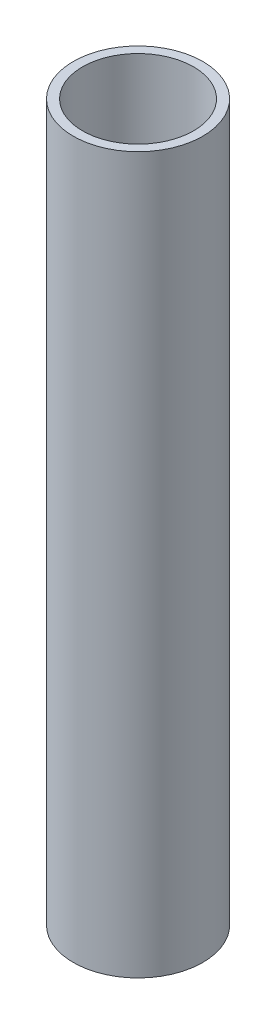
ISO-10303-21;
HEADER;
FILE_DESCRIPTION(('STEP AP214'),'2;1');
FILE_NAME('part.step','',(''),(''),'','','');
FILE_SCHEMA(('AUTOMOTIVE_DESIGN { 1 0 10303 214 1 1 1 1 }'));
ENDSEC;
DATA;
#1=APPLICATION_CONTEXT('core data for automotive mechanical design processes');
#2=APPLICATION_PROTOCOL_DEFINITION('international standard','automotive_design',2000,#1);
#3=PRODUCT_CONTEXT('',#1,'mechanical');
#4=PRODUCT('Part','Part','',(#3));
#5=PRODUCT_RELATED_PRODUCT_CATEGORY('part','',(#4));
#6=PRODUCT_DEFINITION_FORMATION('','',#4);
#7=PRODUCT_DEFINITION_CONTEXT('part definition',#1,'design');
#8=PRODUCT_DEFINITION('design','',#6,#7);
#9=PRODUCT_DEFINITION_SHAPE('','',#8);
#10=(LENGTH_UNIT() NAMED_UNIT(*) SI_UNIT(.MILLI.,.METRE.));
#11=(NAMED_UNIT(*) PLANE_ANGLE_UNIT() SI_UNIT($,.RADIAN.));
#12=(NAMED_UNIT(*) SI_UNIT($,.STERADIAN.) SOLID_ANGLE_UNIT());
#13=UNCERTAINTY_MEASURE_WITH_UNIT(LENGTH_MEASURE(1.E-05),#10,'distance_accuracy_value','');
#14=(GEOMETRIC_REPRESENTATION_CONTEXT(3) GLOBAL_UNCERTAINTY_ASSIGNED_CONTEXT((#13)) GLOBAL_UNIT_ASSIGNED_CONTEXT((#10,
#11,#12)) REPRESENTATION_CONTEXT('',''));
#15=CARTESIAN_POINT('',(0.,0.,0.));
#16=DIRECTION('',(0.,0.,1.));
#17=DIRECTION('',(1.,0.,0.));
#18=AXIS2_PLACEMENT_3D('',#15,#16,#17);
#19=CARTESIAN_POINT('',(0.,232.,0.));
#20=DIRECTION('',(0.,-1.,0.));
#21=DIRECTION('',(0.,0.,-1.));
#22=AXIS2_PLACEMENT_3D('',#19,#20,#21);
#23=CYLINDRICAL_SURFACE('',#22,18.);
#24=CARTESIAN_POINT('',(0.,232.,0.));
#25=DIRECTION('',(0.,1.,0.));
#26=DIRECTION('',(0.,0.,1.));
#27=AXIS2_PLACEMENT_3D('',#24,#25,#26);
#28=CIRCLE('',#27,18.);
#29=CARTESIAN_POINT('',(0.,232.,-18.));
#30=VERTEX_POINT('',#29);
#31=EDGE_CURVE('E47',#30,#30,#28,.T.);
#32=CARTESIAN_POINT('',(0.,0.,0.));
#33=DIRECTION('',(0.,1.,0.));
#34=DIRECTION('',(0.,0.,1.));
#35=AXIS2_PLACEMENT_3D('',#32,#33,#34);
#36=CIRCLE('',#35,18.);
#37=CARTESIAN_POINT('',(0.,0.,-18.));
#38=VERTEX_POINT('',#37);
#39=EDGE_CURVE('E54',#38,#38,#36,.T.);
#40=CARTESIAN_POINT('',(0.,232.,-18.));
#41=CARTESIAN_POINT('',(0.,229.583333333333,-18.));
#42=CARTESIAN_POINT('',(0.,227.166666666667,-18.));
#43=CARTESIAN_POINT('',(0.,222.333333333333,-18.));
#44=CARTESIAN_POINT('',(0.,219.916666666667,-18.));
#45=CARTESIAN_POINT('',(0.,215.083333333333,-18.));
#46=CARTESIAN_POINT('',(0.,212.666666666667,-18.));
#47=CARTESIAN_POINT('',(0.,207.833333333333,-18.));
#48=CARTESIAN_POINT('',(0.,205.416666666667,-18.));
#49=CARTESIAN_POINT('',(0.,200.583333333333,-18.));
#50=CARTESIAN_POINT('',(0.,198.166666666667,-18.));
#51=CARTESIAN_POINT('',(0.,193.333333333333,-18.));
#52=CARTESIAN_POINT('',(0.,190.916666666667,-18.));
#53=CARTESIAN_POINT('',(0.,186.083333333333,-18.));
#54=CARTESIAN_POINT('',(0.,183.666666666667,-18.));
#55=CARTESIAN_POINT('',(0.,178.833333333333,-18.));
#56=CARTESIAN_POINT('',(0.,176.416666666667,-18.));
#57=CARTESIAN_POINT('',(0.,171.583333333333,-18.));
#58=CARTESIAN_POINT('',(0.,169.166666666667,-18.));
#59=CARTESIAN_POINT('',(0.,164.333333333333,-18.));
#60=CARTESIAN_POINT('',(0.,161.916666666667,-18.));
#61=CARTESIAN_POINT('',(0.,157.083333333333,-18.));
#62=CARTESIAN_POINT('',(0.,154.666666666667,-18.));
#63=CARTESIAN_POINT('',(0.,149.833333333333,-18.));
#64=CARTESIAN_POINT('',(0.,147.416666666667,-18.));
#65=CARTESIAN_POINT('',(0.,142.583333333333,-18.));
#66=CARTESIAN_POINT('',(0.,140.166666666667,-18.));
#67=CARTESIAN_POINT('',(0.,135.333333333333,-18.));
#68=CARTESIAN_POINT('',(0.,132.916666666667,-18.));
#69=CARTESIAN_POINT('',(0.,128.083333333333,-18.));
#70=CARTESIAN_POINT('',(0.,125.666666666667,-18.));
#71=CARTESIAN_POINT('',(0.,120.833333333333,-18.));
#72=CARTESIAN_POINT('',(0.,118.416666666667,-18.));
#73=CARTESIAN_POINT('',(0.,113.583333333333,-18.));
#74=CARTESIAN_POINT('',(0.,111.166666666667,-18.));
#75=CARTESIAN_POINT('',(0.,106.333333333333,-18.));
#76=CARTESIAN_POINT('',(0.,103.916666666667,-18.));
#77=CARTESIAN_POINT('',(0.,99.0833333333333,-18.));
#78=CARTESIAN_POINT('',(0.,96.6666666666667,-18.));
#79=CARTESIAN_POINT('',(0.,91.8333333333333,-18.));
#80=CARTESIAN_POINT('',(0.,89.4166666666667,-18.));
#81=CARTESIAN_POINT('',(0.,84.5833333333333,-18.));
#82=CARTESIAN_POINT('',(0.,82.1666666666667,-18.));
#83=CARTESIAN_POINT('',(0.,77.3333333333334,-18.));
#84=CARTESIAN_POINT('',(0.,74.9166666666667,-18.));
#85=CARTESIAN_POINT('',(0.,70.0833333333333,-18.));
#86=CARTESIAN_POINT('',(0.,67.6666666666667,-18.));
#87=CARTESIAN_POINT('',(0.,62.8333333333333,-18.));
#88=CARTESIAN_POINT('',(0.,60.4166666666667,-18.));
#89=CARTESIAN_POINT('',(0.,55.5833333333333,-18.));
#90=CARTESIAN_POINT('',(0.,53.1666666666667,-18.));
#91=CARTESIAN_POINT('',(0.,48.3333333333333,-18.));
#92=CARTESIAN_POINT('',(0.,45.9166666666667,-18.));
#93=CARTESIAN_POINT('',(0.,41.0833333333333,-18.));
#94=CARTESIAN_POINT('',(0.,38.6666666666667,-18.));
#95=CARTESIAN_POINT('',(0.,33.8333333333333,-18.));
#96=CARTESIAN_POINT('',(0.,31.4166666666667,-18.));
#97=CARTESIAN_POINT('',(0.,26.5833333333333,-18.));
#98=CARTESIAN_POINT('',(0.,24.1666666666667,-18.));
#99=CARTESIAN_POINT('',(0.,19.3333333333333,-18.));
#100=CARTESIAN_POINT('',(0.,16.9166666666667,-18.));
#101=CARTESIAN_POINT('',(0.,12.0833333333333,-18.));
#102=CARTESIAN_POINT('',(0.,9.66666666666668,-18.));
#103=CARTESIAN_POINT('',(0.,4.83333333333334,-18.));
#104=CARTESIAN_POINT('',(0.,2.41666666666666,-18.));
#105=CARTESIAN_POINT('',(0.,0.,-18.));
#106=B_SPLINE_CURVE_WITH_KNOTS('',3,(#40,#41,#42,#43,#44,#45,#46,#47,#48,#49,#50,#51,#52,#53,
#54,#55,#56,#57,#58,#59,#60,#61,#62,#63,#64,#65,#66,#67,#68,#69,#70,#71,#72,#73,#74,#75,#76,#77,
#78,#79,#80,#81,#82,#83,#84,#85,#86,#87,#88,#89,#90,#91,#92,#93,#94,#95,#96,#97,#98,#99,#100,
#101,#102,#103,#104,#105),.UNSPECIFIED.,.F.,.F.,(4,2,2,2,2,2,2,2,2,2,2,2,2,2,2,2,2,2,2,2,2,2,2,
2,2,2,2,2,2,2,2,2,4),(0.,7.24999999999998,14.5,21.75,29.,36.25,43.5,50.75,58.,65.25,72.5,79.75,
87.,94.25,101.5,108.75,116.,123.25,130.5,137.75,145.,152.25,159.5,166.75,174.,181.25,188.5,
195.75,203.,210.25,217.5,224.75,232.),.UNSPECIFIED.);
#107=EDGE_CURVE('BSEAM39',#30,#38,#106,.T.);
#108=ORIENTED_EDGE('',*,*,#31,.T.);
#109=ORIENTED_EDGE('',*,*,#39,.F.);
#110=ORIENTED_EDGE('',*,*,#107,.T.);
#111=ORIENTED_EDGE('',*,*,#107,.F.);
#112=EDGE_LOOP('',(#108,#110,#109,#111));
#113=FACE_BOUND('',#112,.T.);
#114=ADVANCED_FACE('F39',(#113),#23,.F.);
#115=CARTESIAN_POINT('',(0.,232.,0.));
#116=DIRECTION('',(0.,-1.,0.));
#117=DIRECTION('',(0.,0.,-1.));
#118=AXIS2_PLACEMENT_3D('',#115,#116,#117);
#119=CYLINDRICAL_SURFACE('',#118,21.);
#120=CARTESIAN_POINT('',(0.,232.,0.));
#121=DIRECTION('',(0.,1.,0.));
#122=DIRECTION('',(0.,0.,1.));
#123=AXIS2_PLACEMENT_3D('',#120,#121,#122);
#124=CIRCLE('',#123,21.);
#125=CARTESIAN_POINT('',(0.,232.,-21.));
#126=VERTEX_POINT('',#125);
#127=EDGE_CURVE('E10',#126,#126,#124,.T.);
#128=CARTESIAN_POINT('',(0.,0.,0.));
#129=DIRECTION('',(0.,1.,0.));
#130=DIRECTION('',(0.,0.,1.));
#131=AXIS2_PLACEMENT_3D('',#128,#129,#130);
#132=CIRCLE('',#131,21.);
#133=CARTESIAN_POINT('',(0.,0.,-21.));
#134=VERTEX_POINT('',#133);
#135=EDGE_CURVE('E42',#134,#134,#132,.T.);
#136=CARTESIAN_POINT('',(0.,232.,-21.));
#137=CARTESIAN_POINT('',(0.,229.583333333333,-21.));
#138=CARTESIAN_POINT('',(0.,227.166666666667,-21.));
#139=CARTESIAN_POINT('',(0.,222.333333333333,-21.));
#140=CARTESIAN_POINT('',(0.,219.916666666667,-21.));
#141=CARTESIAN_POINT('',(0.,215.083333333333,-21.));
#142=CARTESIAN_POINT('',(0.,212.666666666667,-21.));
#143=CARTESIAN_POINT('',(0.,207.833333333333,-21.));
#144=CARTESIAN_POINT('',(0.,205.416666666667,-21.));
#145=CARTESIAN_POINT('',(0.,200.583333333333,-21.));
#146=CARTESIAN_POINT('',(0.,198.166666666667,-21.));
#147=CARTESIAN_POINT('',(0.,193.333333333333,-21.));
#148=CARTESIAN_POINT('',(0.,190.916666666667,-21.));
#149=CARTESIAN_POINT('',(0.,186.083333333333,-21.));
#150=CARTESIAN_POINT('',(0.,183.666666666667,-21.));
#151=CARTESIAN_POINT('',(0.,178.833333333333,-21.));
#152=CARTESIAN_POINT('',(0.,176.416666666667,-21.));
#153=CARTESIAN_POINT('',(0.,171.583333333333,-21.));
#154=CARTESIAN_POINT('',(0.,169.166666666667,-21.));
#155=CARTESIAN_POINT('',(0.,164.333333333333,-21.));
#156=CARTESIAN_POINT('',(0.,161.916666666667,-21.));
#157=CARTESIAN_POINT('',(0.,157.083333333333,-21.));
#158=CARTESIAN_POINT('',(0.,154.666666666667,-21.));
#159=CARTESIAN_POINT('',(0.,149.833333333333,-21.));
#160=CARTESIAN_POINT('',(0.,147.416666666667,-21.));
#161=CARTESIAN_POINT('',(0.,142.583333333333,-21.));
#162=CARTESIAN_POINT('',(0.,140.166666666667,-21.));
#163=CARTESIAN_POINT('',(0.,135.333333333333,-21.));
#164=CARTESIAN_POINT('',(0.,132.916666666667,-21.));
#165=CARTESIAN_POINT('',(0.,128.083333333333,-21.));
#166=CARTESIAN_POINT('',(0.,125.666666666667,-21.));
#167=CARTESIAN_POINT('',(0.,120.833333333333,-21.));
#168=CARTESIAN_POINT('',(0.,118.416666666667,-21.));
#169=CARTESIAN_POINT('',(0.,113.583333333333,-21.));
#170=CARTESIAN_POINT('',(0.,111.166666666667,-21.));
#171=CARTESIAN_POINT('',(0.,106.333333333333,-21.));
#172=CARTESIAN_POINT('',(0.,103.916666666667,-21.));
#173=CARTESIAN_POINT('',(0.,99.0833333333333,-21.));
#174=CARTESIAN_POINT('',(0.,96.6666666666667,-21.));
#175=CARTESIAN_POINT('',(0.,91.8333333333334,-21.));
#176=CARTESIAN_POINT('',(0.,89.4166666666667,-21.));
#177=CARTESIAN_POINT('',(0.,84.5833333333334,-21.));
#178=CARTESIAN_POINT('',(0.,82.1666666666667,-21.));
#179=CARTESIAN_POINT('',(0.,77.3333333333334,-21.));
#180=CARTESIAN_POINT('',(0.,74.9166666666667,-21.));
#181=CARTESIAN_POINT('',(0.,70.0833333333333,-21.));
#182=CARTESIAN_POINT('',(0.,67.6666666666667,-21.));
#183=CARTESIAN_POINT('',(0.,62.8333333333333,-21.));
#184=CARTESIAN_POINT('',(0.,60.4166666666667,-21.));
#185=CARTESIAN_POINT('',(0.,55.5833333333333,-21.));
#186=CARTESIAN_POINT('',(0.,53.1666666666667,-21.));
#187=CARTESIAN_POINT('',(0.,48.3333333333333,-21.));
#188=CARTESIAN_POINT('',(0.,45.9166666666667,-21.));
#189=CARTESIAN_POINT('',(0.,41.0833333333333,-21.));
#190=CARTESIAN_POINT('',(0.,38.6666666666667,-21.));
#191=CARTESIAN_POINT('',(0.,33.8333333333333,-21.));
#192=CARTESIAN_POINT('',(0.,31.4166666666667,-21.));
#193=CARTESIAN_POINT('',(0.,26.5833333333333,-21.));
#194=CARTESIAN_POINT('',(0.,24.1666666666667,-21.));
#195=CARTESIAN_POINT('',(0.,19.3333333333333,-21.));
#196=CARTESIAN_POINT('',(0.,16.9166666666667,-21.));
#197=CARTESIAN_POINT('',(0.,12.0833333333333,-21.));
#198=CARTESIAN_POINT('',(0.,9.66666666666668,-21.));
#199=CARTESIAN_POINT('',(0.,4.83333333333334,-21.));
#200=CARTESIAN_POINT('',(0.,2.41666666666666,-21.));
#201=CARTESIAN_POINT('',(0.,0.,-21.));
#202=B_SPLINE_CURVE_WITH_KNOTS('',3,(#136,#137,#138,#139,#140,#141,#142,#143,#144,#145,#146,
#147,#148,#149,#150,#151,#152,#153,#154,#155,#156,#157,#158,#159,#160,#161,#162,#163,#164,#165,
#166,#167,#168,#169,#170,#171,#172,#173,#174,#175,#176,#177,#178,#179,#180,#181,#182,#183,#184,
#185,#186,#187,#188,#189,#190,#191,#192,#193,#194,#195,#196,#197,#198,#199,#200,#201),
.UNSPECIFIED.,.F.,.F.,(4,2,2,2,2,2,2,2,2,2,2,2,2,2,2,2,2,2,2,2,2,2,2,2,2,2,2,2,2,2,2,2,4),(0.,
7.25000000000001,14.5,21.75,29.,36.25,43.5,50.75,58.,65.25,72.5,79.75,87.,94.25,101.5,108.75,
116.,123.25,130.5,137.75,145.,152.25,159.5,166.75,174.,181.25,188.5,195.75,203.,210.25,217.5,
224.75,232.),.UNSPECIFIED.);
#203=EDGE_CURVE('BSEAM63',#126,#134,#202,.T.);
#204=ORIENTED_EDGE('',*,*,#127,.F.);
#205=ORIENTED_EDGE('',*,*,#135,.T.);
#206=ORIENTED_EDGE('',*,*,#203,.T.);
#207=ORIENTED_EDGE('',*,*,#203,.F.);
#208=EDGE_LOOP('',(#204,#206,#205,#207));
#209=FACE_BOUND('',#208,.T.);
#210=ADVANCED_FACE('F63',(#209),#119,.T.);
#211=CARTESIAN_POINT('',(0.,232.,0.));
#212=DIRECTION('',(0.,1.,0.));
#213=DIRECTION('',(0.,0.,1.));
#214=AXIS2_PLACEMENT_3D('',#211,#212,#213);
#215=PLANE('',#214);
#216=ORIENTED_EDGE('',*,*,#31,.F.);
#217=EDGE_LOOP('',(#216));
#218=FACE_BOUND('',#217,.T.);
#219=ORIENTED_EDGE('',*,*,#127,.T.);
#220=EDGE_LOOP('',(#219));
#221=FACE_BOUND('',#220,.T.);
#222=ADVANCED_FACE('F67',(#218,#221),#215,.T.);
#223=CARTESIAN_POINT('',(0.,0.,0.));
#224=DIRECTION('',(0.,1.,0.));
#225=DIRECTION('',(0.,0.,1.));
#226=AXIS2_PLACEMENT_3D('',#223,#224,#225);
#227=PLANE('',#226);
#228=ORIENTED_EDGE('',*,*,#39,.T.);
#229=EDGE_LOOP('',(#228));
#230=FACE_BOUND('',#229,.T.);
#231=ORIENTED_EDGE('',*,*,#135,.F.);
#232=EDGE_LOOP('',(#231));
#233=FACE_BOUND('',#232,.T.);
#234=ADVANCED_FACE('F65',(#230,#233),#227,.F.);
#235=CLOSED_SHELL('',(#114,#210,#222,#234));
#236=MANIFOLD_SOLID_BREP('B2',#235);
#237=ADVANCED_BREP_SHAPE_REPRESENTATION('',(#18,#236),#14);
#238=SHAPE_DEFINITION_REPRESENTATION(#9,#237);
ENDSEC;
END-ISO-10303-21;
